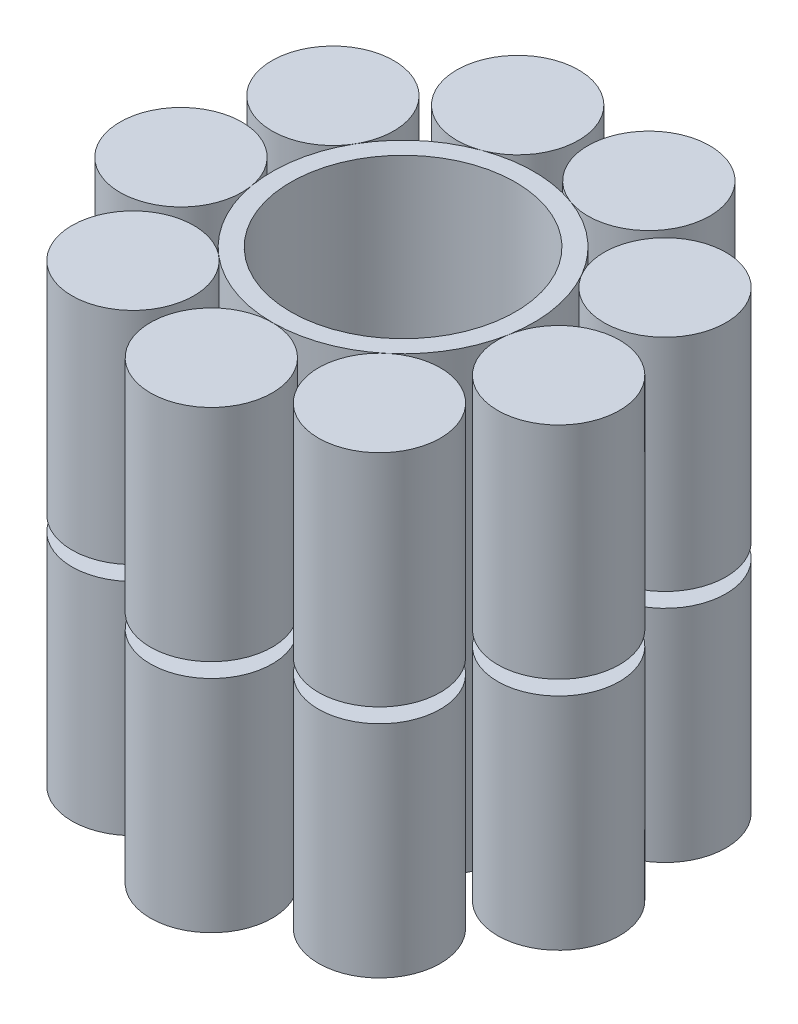
ISO-10303-21;
HEADER;
FILE_DESCRIPTION(('STEP AP214'),'2;1');
FILE_NAME('part.step','',(''),(''),'','','');
FILE_SCHEMA(('AUTOMOTIVE_DESIGN { 1 0 10303 214 1 1 1 1 }'));
ENDSEC;
DATA;
#1=APPLICATION_CONTEXT('core data for automotive mechanical design processes');
#2=APPLICATION_PROTOCOL_DEFINITION('international standard','automotive_design',2000,#1);
#3=PRODUCT_CONTEXT('',#1,'mechanical');
#4=PRODUCT('Part','Part','',(#3));
#5=PRODUCT_RELATED_PRODUCT_CATEGORY('part','',(#4));
#6=PRODUCT_DEFINITION_FORMATION('','',#4);
#7=PRODUCT_DEFINITION_CONTEXT('part definition',#1,'design');
#8=PRODUCT_DEFINITION('design','',#6,#7);
#9=PRODUCT_DEFINITION_SHAPE('','',#8);
#10=(LENGTH_UNIT() NAMED_UNIT(*) SI_UNIT(.MILLI.,.METRE.));
#11=(NAMED_UNIT(*) PLANE_ANGLE_UNIT() SI_UNIT($,.RADIAN.));
#12=(NAMED_UNIT(*) SI_UNIT($,.STERADIAN.) SOLID_ANGLE_UNIT());
#13=UNCERTAINTY_MEASURE_WITH_UNIT(LENGTH_MEASURE(1.E-05),#10,'distance_accuracy_value','');
#14=(GEOMETRIC_REPRESENTATION_CONTEXT(3) GLOBAL_UNCERTAINTY_ASSIGNED_CONTEXT((#13)) GLOBAL_UNIT_ASSIGNED_CONTEXT((#10,
#11,#12)) REPRESENTATION_CONTEXT('',''));
#15=CARTESIAN_POINT('',(0.,0.,0.));
#16=DIRECTION('',(0.,0.,1.));
#17=DIRECTION('',(1.,0.,0.));
#18=AXIS2_PLACEMENT_3D('',#15,#16,#17);
#19=CARTESIAN_POINT('',(-34.4087421403248,127.,41.0067420623809));
#20=DIRECTION('',(0.,-1.,0.));
#21=DIRECTION('',(0.64278760968653,0.,-0.766044443118986));
#22=AXIS2_PLACEMENT_3D('',#19,#20,#21);
#23=CYLINDRICAL_SURFACE('',#22,17.018);
#24=CARTESIAN_POINT('',(-34.4087421403248,65.532,41.0067420623809));
#25=DIRECTION('',(0.,1.,0.));
#26=DIRECTION('',(0.,0.,1.));
#27=AXIS2_PLACEMENT_3D('',#24,#25,#26);
#28=CIRCLE('',#27,17.018);
#29=CARTESIAN_POINT('',(-34.4087421403248,65.532,58.0247420623809));
#30=VERTEX_POINT('',#29);
#31=EDGE_CURVE('E49',#30,#30,#28,.T.);
#32=ORIENTED_EDGE('',*,*,#31,.T.);
#33=EDGE_LOOP('',(#32));
#34=FACE_BOUND('',#33,.T.);
#35=CARTESIAN_POINT('',(-34.4087421403248,127.,41.0067420623809));
#36=DIRECTION('',(0.,1.,0.));
#37=DIRECTION('',(-0.64278760968653,0.,0.766044443118986));
#38=AXIS2_PLACEMENT_3D('',#35,#36,#37);
#39=CIRCLE('',#38,17.018);
#40=CARTESIAN_POINT('',(-45.3477016819702,127.,54.0432863953798));
#41=VERTEX_POINT('',#40);
#42=EDGE_CURVE('E11',#41,#41,#39,.T.);
#43=ORIENTED_EDGE('',*,*,#42,.F.);
#44=EDGE_LOOP('',(#43));
#45=FACE_BOUND('',#44,.T.);
#46=ADVANCED_FACE('F43',(#34,#45),#23,.T.);
#47=CARTESIAN_POINT('',(-34.4087421403248,127.,41.0067420623809));
#48=DIRECTION('',(0.,1.,0.));
#49=DIRECTION('',(-0.64278760968653,0.,0.766044443118986));
#50=AXIS2_PLACEMENT_3D('',#47,#48,#49);
#51=PLANE('',#50);
#52=ORIENTED_EDGE('',*,*,#42,.T.);
#53=EDGE_LOOP('',(#52));
#54=FACE_BOUND('',#53,.T.);
#55=ADVANCED_FACE('F59',(#54),#51,.T.);
#56=CARTESIAN_POINT('',(0.,65.532,0.));
#57=DIRECTION('',(0.,1.,0.));
#58=DIRECTION('',(0.,0.,1.));
#59=AXIS2_PLACEMENT_3D('',#56,#57,#58);
#60=PLANE('',#59);
#61=ORIENTED_EDGE('',*,*,#31,.F.);
#62=EDGE_LOOP('',(#61));
#63=FACE_BOUND('',#62,.T.);
#64=ADVANCED_FACE('F57',(#63),#60,.F.);
#65=CLOSED_SHELL('',(#46,#55,#64));
#66=MANIFOLD_SOLID_BREP('B2',#65);
#67=CARTESIAN_POINT('',(-52.7172514226199,127.,9.29547377460016));
#68=DIRECTION('',(0.,-1.,0.));
#69=DIRECTION('',(0.984807753012206,0.,-0.17364817766694));
#70=AXIS2_PLACEMENT_3D('',#67,#68,#69);
#71=CYLINDRICAL_SURFACE('',#70,17.018);
#72=CARTESIAN_POINT('',(-52.7172514226199,65.532,9.29547377460016));
#73=DIRECTION('',(0.,1.,0.));
#74=DIRECTION('',(0.,0.,1.));
#75=AXIS2_PLACEMENT_3D('',#72,#73,#74);
#76=CIRCLE('',#75,17.018);
#77=CARTESIAN_POINT('',(-52.7172514226199,65.532,26.3134737746002));
#78=VERTEX_POINT('',#77);
#79=EDGE_CURVE('E97',#78,#78,#76,.T.);
#80=ORIENTED_EDGE('',*,*,#79,.T.);
#81=EDGE_LOOP('',(#80));
#82=FACE_BOUND('',#81,.T.);
#83=CARTESIAN_POINT('',(-52.7172514226199,127.,9.29547377460016));
#84=DIRECTION('',(0.,1.,0.));
#85=DIRECTION('',(-0.984807753012206,0.,0.17364817766694));
#86=AXIS2_PLACEMENT_3D('',#83,#84,#85);
#87=CIRCLE('',#86,17.018);
#88=CARTESIAN_POINT('',(-69.4767097633816,127.,12.2506184621361));
#89=VERTEX_POINT('',#88);
#90=EDGE_CURVE('E42',#89,#89,#87,.T.);
#91=ORIENTED_EDGE('',*,*,#90,.F.);
#92=EDGE_LOOP('',(#91));
#93=FACE_BOUND('',#92,.T.);
#94=ADVANCED_FACE('F91',(#82,#93),#71,.T.);
#95=CARTESIAN_POINT('',(-52.7172514226199,127.,9.29547377460016));
#96=DIRECTION('',(0.,1.,0.));
#97=DIRECTION('',(-0.984807753012206,0.,0.17364817766694));
#98=AXIS2_PLACEMENT_3D('',#95,#96,#97);
#99=PLANE('',#98);
#100=ORIENTED_EDGE('',*,*,#90,.T.);
#101=EDGE_LOOP('',(#100));
#102=FACE_BOUND('',#101,.T.);
#103=ADVANCED_FACE('F107',(#102),#99,.T.);
#104=CARTESIAN_POINT('',(0.,65.532,0.));
#105=DIRECTION('',(0.,1.,0.));
#106=DIRECTION('',(0.,0.,1.));
#107=AXIS2_PLACEMENT_3D('',#104,#105,#106);
#108=PLANE('',#107);
#109=ORIENTED_EDGE('',*,*,#79,.F.);
#110=EDGE_LOOP('',(#109));
#111=FACE_BOUND('',#110,.T.);
#112=ADVANCED_FACE('F105',(#111),#108,.F.);
#113=CLOSED_SHELL('',(#94,#103,#112));
#114=MANIFOLD_SOLID_BREP('B6',#113);
#115=CARTESIAN_POINT('',(-46.3587728772831,127.,-26.7652499999996));
#116=DIRECTION('',(0.,-1.,0.));
#117=DIRECTION('',(0.866025403784443,0.,0.499999999999992));
#118=AXIS2_PLACEMENT_3D('',#115,#116,#117);
#119=CYLINDRICAL_SURFACE('',#118,17.018);
#120=CARTESIAN_POINT('',(-46.3587728772831,65.532,-26.7652499999996));
#121=DIRECTION('',(0.,1.,0.));
#122=DIRECTION('',(0.,0.,1.));
#123=AXIS2_PLACEMENT_3D('',#120,#121,#122);
#124=CIRCLE('',#123,17.018);
#125=CARTESIAN_POINT('',(-46.3587728772831,65.532,-9.74724999999957));
#126=VERTEX_POINT('',#125);
#127=EDGE_CURVE('E145',#126,#126,#124,.T.);
#128=ORIENTED_EDGE('',*,*,#127,.T.);
#129=EDGE_LOOP('',(#128));
#130=FACE_BOUND('',#129,.T.);
#131=CARTESIAN_POINT('',(-46.3587728772831,127.,-26.7652499999996));
#132=DIRECTION('',(0.,1.,0.));
#133=DIRECTION('',(-0.866025403784443,0.,-0.499999999999992));
#134=AXIS2_PLACEMENT_3D('',#131,#132,#133);
#135=CIRCLE('',#134,17.018);
#136=CARTESIAN_POINT('',(-61.0967931988868,127.,-35.2742499999994));
#137=VERTEX_POINT('',#136);
#138=EDGE_CURVE('E90',#137,#137,#135,.T.);
#139=ORIENTED_EDGE('',*,*,#138,.F.);
#140=EDGE_LOOP('',(#139));
#141=FACE_BOUND('',#140,.T.);
#142=ADVANCED_FACE('F139',(#130,#141),#119,.T.);
#143=CARTESIAN_POINT('',(-46.3587728772831,127.,-26.7652499999996));
#144=DIRECTION('',(0.,1.,0.));
#145=DIRECTION('',(-0.866025403784443,0.,-0.499999999999992));
#146=AXIS2_PLACEMENT_3D('',#143,#144,#145);
#147=PLANE('',#146);
#148=ORIENTED_EDGE('',*,*,#138,.T.);
#149=EDGE_LOOP('',(#148));
#150=FACE_BOUND('',#149,.T.);
#151=ADVANCED_FACE('F155',(#150),#147,.T.);
#152=CARTESIAN_POINT('',(0.,65.532,0.));
#153=DIRECTION('',(0.,1.,0.));
#154=DIRECTION('',(0.,0.,1.));
#155=AXIS2_PLACEMENT_3D('',#152,#153,#154);
#156=PLANE('',#155);
#157=ORIENTED_EDGE('',*,*,#127,.F.);
#158=EDGE_LOOP('',(#157));
#159=FACE_BOUND('',#158,.T.);
#160=ADVANCED_FACE('F153',(#159),#156,.F.);
#161=CLOSED_SHELL('',(#142,#151,#160));
#162=MANIFOLD_SOLID_BREP('B37',#161);
#163=CARTESIAN_POINT('',(-18.3085092822951,127.,-50.3022158369799));
#164=DIRECTION('',(0.,-1.,0.));
#165=DIRECTION('',(0.342020143325676,0.,0.939692620785906));
#166=AXIS2_PLACEMENT_3D('',#163,#164,#165);
#167=CYLINDRICAL_SURFACE('',#166,17.018);
#168=CARTESIAN_POINT('',(-18.3085092822951,65.532,-50.3022158369799));
#169=DIRECTION('',(0.,1.,0.));
#170=DIRECTION('',(0.,0.,1.));
#171=AXIS2_PLACEMENT_3D('',#168,#169,#170);
#172=CIRCLE('',#171,17.018);
#173=CARTESIAN_POINT('',(-18.3085092822951,65.532,-33.2842158369799));
#174=VERTEX_POINT('',#173);
#175=EDGE_CURVE('E193',#174,#174,#172,.T.);
#176=ORIENTED_EDGE('',*,*,#175,.T.);
#177=EDGE_LOOP('',(#176));
#178=FACE_BOUND('',#177,.T.);
#179=CARTESIAN_POINT('',(-18.3085092822951,127.,-50.3022158369799));
#180=DIRECTION('',(0.,1.,0.));
#181=DIRECTION('',(-0.342020143325676,0.,-0.939692620785906));
#182=AXIS2_PLACEMENT_3D('',#179,#180,#181);
#183=CIRCLE('',#182,17.018);
#184=CARTESIAN_POINT('',(-24.1290080814114,127.,-66.2939048575145));
#185=VERTEX_POINT('',#184);
#186=EDGE_CURVE('E138',#185,#185,#183,.T.);
#187=ORIENTED_EDGE('',*,*,#186,.F.);
#188=EDGE_LOOP('',(#187));
#189=FACE_BOUND('',#188,.T.);
#190=ADVANCED_FACE('F187',(#178,#189),#167,.T.);
#191=CARTESIAN_POINT('',(-18.3085092822951,127.,-50.3022158369799));
#192=DIRECTION('',(0.,1.,0.));
#193=DIRECTION('',(-0.342020143325676,0.,-0.939692620785906));
#194=AXIS2_PLACEMENT_3D('',#191,#192,#193);
#195=PLANE('',#194);
#196=ORIENTED_EDGE('',*,*,#186,.T.);
#197=EDGE_LOOP('',(#196));
#198=FACE_BOUND('',#197,.T.);
#199=ADVANCED_FACE('F203',(#198),#195,.T.);
#200=CARTESIAN_POINT('',(0.,65.532,0.));
#201=DIRECTION('',(0.,1.,0.));
#202=DIRECTION('',(0.,0.,1.));
#203=AXIS2_PLACEMENT_3D('',#200,#201,#202);
#204=PLANE('',#203);
#205=ORIENTED_EDGE('',*,*,#175,.F.);
#206=EDGE_LOOP('',(#205));
#207=FACE_BOUND('',#206,.T.);
#208=ADVANCED_FACE('F201',(#207),#204,.F.);
#209=CLOSED_SHELL('',(#190,#199,#208));
#210=MANIFOLD_SOLID_BREP('B85',#209);
#211=CARTESIAN_POINT('',(18.3085092822944,127.,-50.3022158369802));
#212=DIRECTION('',(0.,-1.,0.));
#213=DIRECTION('',(-0.342020143325663,0.,0.939692620785911));
#214=AXIS2_PLACEMENT_3D('',#211,#212,#213);
#215=CYLINDRICAL_SURFACE('',#214,17.018);
#216=CARTESIAN_POINT('',(18.3085092822944,65.532,-50.3022158369802));
#217=DIRECTION('',(0.,1.,0.));
#218=DIRECTION('',(0.,0.,1.));
#219=AXIS2_PLACEMENT_3D('',#216,#217,#218);
#220=CIRCLE('',#219,17.018);
#221=CARTESIAN_POINT('',(18.3085092822944,65.532,-33.2842158369802));
#222=VERTEX_POINT('',#221);
#223=EDGE_CURVE('E241',#222,#222,#220,.T.);
#224=ORIENTED_EDGE('',*,*,#223,.T.);
#225=EDGE_LOOP('',(#224));
#226=FACE_BOUND('',#225,.T.);
#227=CARTESIAN_POINT('',(18.3085092822944,127.,-50.3022158369802));
#228=DIRECTION('',(0.,1.,0.));
#229=DIRECTION('',(0.342020143325663,0.,-0.939692620785911));
#230=AXIS2_PLACEMENT_3D('',#227,#228,#229);
#231=CIRCLE('',#230,17.018);
#232=CARTESIAN_POINT('',(24.1290080814105,127.,-66.2939048575148));
#233=VERTEX_POINT('',#232);
#234=EDGE_CURVE('E186',#233,#233,#231,.T.);
#235=ORIENTED_EDGE('',*,*,#234,.F.);
#236=EDGE_LOOP('',(#235));
#237=FACE_BOUND('',#236,.T.);
#238=ADVANCED_FACE('F235',(#226,#237),#215,.T.);
#239=CARTESIAN_POINT('',(18.3085092822944,127.,-50.3022158369802));
#240=DIRECTION('',(0.,1.,0.));
#241=DIRECTION('',(0.342020143325663,0.,-0.939692620785911));
#242=AXIS2_PLACEMENT_3D('',#239,#240,#241);
#243=PLANE('',#242);
#244=ORIENTED_EDGE('',*,*,#234,.T.);
#245=EDGE_LOOP('',(#244));
#246=FACE_BOUND('',#245,.T.);
#247=ADVANCED_FACE('F251',(#246),#243,.T.);
#248=CARTESIAN_POINT('',(0.,65.532,0.));
#249=DIRECTION('',(0.,1.,0.));
#250=DIRECTION('',(0.,0.,1.));
#251=AXIS2_PLACEMENT_3D('',#248,#249,#250);
#252=PLANE('',#251);
#253=ORIENTED_EDGE('',*,*,#223,.F.);
#254=EDGE_LOOP('',(#253));
#255=FACE_BOUND('',#254,.T.);
#256=ADVANCED_FACE('F249',(#255),#252,.F.);
#257=CLOSED_SHELL('',(#238,#247,#256));
#258=MANIFOLD_SOLID_BREP('B133',#257);
#259=CARTESIAN_POINT('',(46.3587728772828,127.,-26.7652500000002));
#260=DIRECTION('',(0.,-1.,0.));
#261=DIRECTION('',(-0.866025403784436,0.,0.500000000000004));
#262=AXIS2_PLACEMENT_3D('',#259,#260,#261);
#263=CYLINDRICAL_SURFACE('',#262,17.018);
#264=CARTESIAN_POINT('',(46.3587728772828,65.532,-26.7652500000002));
#265=DIRECTION('',(0.,1.,0.));
#266=DIRECTION('',(0.,0.,1.));
#267=AXIS2_PLACEMENT_3D('',#264,#265,#266);
#268=CIRCLE('',#267,17.018);
#269=CARTESIAN_POINT('',(46.3587728772828,65.532,-9.74725000000021));
#270=VERTEX_POINT('',#269);
#271=EDGE_CURVE('E289',#270,#270,#268,.T.);
#272=ORIENTED_EDGE('',*,*,#271,.T.);
#273=EDGE_LOOP('',(#272));
#274=FACE_BOUND('',#273,.T.);
#275=CARTESIAN_POINT('',(46.3587728772828,127.,-26.7652500000002));
#276=DIRECTION('',(0.,1.,0.));
#277=DIRECTION('',(0.866025403784436,0.,-0.500000000000004));
#278=AXIS2_PLACEMENT_3D('',#275,#276,#277);
#279=CIRCLE('',#278,17.018);
#280=CARTESIAN_POINT('',(61.0967931988863,127.,-35.2742500000003));
#281=VERTEX_POINT('',#280);
#282=EDGE_CURVE('E234',#281,#281,#279,.T.);
#283=ORIENTED_EDGE('',*,*,#282,.F.);
#284=EDGE_LOOP('',(#283));
#285=FACE_BOUND('',#284,.T.);
#286=ADVANCED_FACE('F283',(#274,#285),#263,.T.);
#287=CARTESIAN_POINT('',(46.3587728772828,127.,-26.7652500000002));
#288=DIRECTION('',(0.,1.,0.));
#289=DIRECTION('',(0.866025403784436,0.,-0.500000000000004));
#290=AXIS2_PLACEMENT_3D('',#287,#288,#289);
#291=PLANE('',#290);
#292=ORIENTED_EDGE('',*,*,#282,.T.);
#293=EDGE_LOOP('',(#292));
#294=FACE_BOUND('',#293,.T.);
#295=ADVANCED_FACE('F299',(#294),#291,.T.);
#296=CARTESIAN_POINT('',(0.,65.532,0.));
#297=DIRECTION('',(0.,1.,0.));
#298=DIRECTION('',(0.,0.,1.));
#299=AXIS2_PLACEMENT_3D('',#296,#297,#298);
#300=PLANE('',#299);
#301=ORIENTED_EDGE('',*,*,#271,.F.);
#302=EDGE_LOOP('',(#301));
#303=FACE_BOUND('',#302,.T.);
#304=ADVANCED_FACE('F297',(#303),#300,.F.);
#305=CLOSED_SHELL('',(#286,#295,#304));
#306=MANIFOLD_SOLID_BREP('B181',#305);
#307=CARTESIAN_POINT('',(52.71725142262,127.,9.29547377459945));
#308=DIRECTION('',(0.,-1.,0.));
#309=DIRECTION('',(-0.984807753012209,0.,-0.173648177666927));
#310=AXIS2_PLACEMENT_3D('',#307,#308,#309);
#311=CYLINDRICAL_SURFACE('',#310,17.018);
#312=CARTESIAN_POINT('',(52.71725142262,65.532,9.29547377459945));
#313=DIRECTION('',(0.,1.,0.));
#314=DIRECTION('',(0.,0.,1.));
#315=AXIS2_PLACEMENT_3D('',#312,#313,#314);
#316=CIRCLE('',#315,17.018);
#317=CARTESIAN_POINT('',(52.71725142262,65.532,26.3134737745995));
#318=VERTEX_POINT('',#317);
#319=EDGE_CURVE('E337',#318,#318,#316,.T.);
#320=ORIENTED_EDGE('',*,*,#319,.T.);
#321=EDGE_LOOP('',(#320));
#322=FACE_BOUND('',#321,.T.);
#323=CARTESIAN_POINT('',(52.71725142262,127.,9.29547377459945));
#324=DIRECTION('',(0.,1.,0.));
#325=DIRECTION('',(0.984807753012209,0.,0.173648177666927));
#326=AXIS2_PLACEMENT_3D('',#323,#324,#325);
#327=CIRCLE('',#326,17.018);
#328=CARTESIAN_POINT('',(69.4767097633818,127.,12.2506184621352));
#329=VERTEX_POINT('',#328);
#330=EDGE_CURVE('E282',#329,#329,#327,.T.);
#331=ORIENTED_EDGE('',*,*,#330,.F.);
#332=EDGE_LOOP('',(#331));
#333=FACE_BOUND('',#332,.T.);
#334=ADVANCED_FACE('F331',(#322,#333),#311,.T.);
#335=CARTESIAN_POINT('',(52.71725142262,127.,9.29547377459945));
#336=DIRECTION('',(0.,1.,0.));
#337=DIRECTION('',(0.984807753012209,0.,0.173648177666927));
#338=AXIS2_PLACEMENT_3D('',#335,#336,#337);
#339=PLANE('',#338);
#340=ORIENTED_EDGE('',*,*,#330,.T.);
#341=EDGE_LOOP('',(#340));
#342=FACE_BOUND('',#341,.T.);
#343=ADVANCED_FACE('F347',(#342),#339,.T.);
#344=CARTESIAN_POINT('',(0.,65.532,0.));
#345=DIRECTION('',(0.,1.,0.));
#346=DIRECTION('',(0.,0.,1.));
#347=AXIS2_PLACEMENT_3D('',#344,#345,#346);
#348=PLANE('',#347);
#349=ORIENTED_EDGE('',*,*,#319,.F.);
#350=EDGE_LOOP('',(#349));
#351=FACE_BOUND('',#350,.T.);
#352=ADVANCED_FACE('F345',(#351),#348,.F.);
#353=CLOSED_SHELL('',(#334,#343,#352));
#354=MANIFOLD_SOLID_BREP('B229',#353);
#355=CARTESIAN_POINT('',(34.4087421403254,127.,41.0067420623804));
#356=DIRECTION('',(0.,-1.,0.));
#357=DIRECTION('',(-0.642787609686541,0.,-0.766044443118977));
#358=AXIS2_PLACEMENT_3D('',#355,#356,#357);
#359=CYLINDRICAL_SURFACE('',#358,17.018);
#360=CARTESIAN_POINT('',(34.4087421403254,65.532,41.0067420623804));
#361=DIRECTION('',(0.,1.,0.));
#362=DIRECTION('',(0.,0.,1.));
#363=AXIS2_PLACEMENT_3D('',#360,#361,#362);
#364=CIRCLE('',#363,17.018);
#365=CARTESIAN_POINT('',(34.4087421403254,65.532,58.0247420623804));
#366=VERTEX_POINT('',#365);
#367=EDGE_CURVE('E385',#366,#366,#364,.T.);
#368=ORIENTED_EDGE('',*,*,#367,.T.);
#369=EDGE_LOOP('',(#368));
#370=FACE_BOUND('',#369,.T.);
#371=CARTESIAN_POINT('',(34.4087421403254,127.,41.0067420623804));
#372=DIRECTION('',(0.,1.,0.));
#373=DIRECTION('',(0.642787609686541,0.,0.766044443118977));
#374=AXIS2_PLACEMENT_3D('',#371,#372,#373);
#375=CIRCLE('',#374,17.018);
#376=CARTESIAN_POINT('',(45.3477016819709,127.,54.0432863953792));
#377=VERTEX_POINT('',#376);
#378=EDGE_CURVE('E330',#377,#377,#375,.T.);
#379=ORIENTED_EDGE('',*,*,#378,.F.);
#380=EDGE_LOOP('',(#379));
#381=FACE_BOUND('',#380,.T.);
#382=ADVANCED_FACE('F379',(#370,#381),#359,.T.);
#383=CARTESIAN_POINT('',(34.4087421403254,127.,41.0067420623804));
#384=DIRECTION('',(0.,1.,0.));
#385=DIRECTION('',(0.642787609686541,0.,0.766044443118977));
#386=AXIS2_PLACEMENT_3D('',#383,#384,#385);
#387=PLANE('',#386);
#388=ORIENTED_EDGE('',*,*,#378,.T.);
#389=EDGE_LOOP('',(#388));
#390=FACE_BOUND('',#389,.T.);
#391=ADVANCED_FACE('F395',(#390),#387,.T.);
#392=CARTESIAN_POINT('',(0.,65.532,0.));
#393=DIRECTION('',(0.,1.,0.));
#394=DIRECTION('',(0.,0.,1.));
#395=AXIS2_PLACEMENT_3D('',#392,#393,#394);
#396=PLANE('',#395);
#397=ORIENTED_EDGE('',*,*,#367,.F.);
#398=EDGE_LOOP('',(#397));
#399=FACE_BOUND('',#398,.T.);
#400=ADVANCED_FACE('F393',(#399),#396,.F.);
#401=CLOSED_SHELL('',(#382,#391,#400));
#402=MANIFOLD_SOLID_BREP('B277',#401);
#403=CARTESIAN_POINT('',(0.,127.,53.5305));
#404=DIRECTION('',(0.,-1.,0.));
#405=DIRECTION('',(0.,0.,-1.));
#406=AXIS2_PLACEMENT_3D('',#403,#404,#405);
#407=CYLINDRICAL_SURFACE('',#406,17.018);
#408=CARTESIAN_POINT('',(0.,65.532,53.5305));
#409=DIRECTION('',(0.,1.,0.));
#410=DIRECTION('',(0.,0.,1.));
#411=AXIS2_PLACEMENT_3D('',#408,#409,#410);
#412=CIRCLE('',#411,17.018);
#413=CARTESIAN_POINT('',(0.,65.532,70.5485));
#414=VERTEX_POINT('',#413);
#415=EDGE_CURVE('E433',#414,#414,#412,.T.);
#416=ORIENTED_EDGE('',*,*,#415,.T.);
#417=EDGE_LOOP('',(#416));
#418=FACE_BOUND('',#417,.T.);
#419=CARTESIAN_POINT('',(0.,127.,53.5305));
#420=DIRECTION('',(0.,1.,0.));
#421=DIRECTION('',(0.,0.,1.));
#422=AXIS2_PLACEMENT_3D('',#419,#420,#421);
#423=CIRCLE('',#422,17.018);
#424=CARTESIAN_POINT('',(0.,127.,70.5485));
#425=VERTEX_POINT('',#424);
#426=EDGE_CURVE('E378',#425,#425,#423,.T.);
#427=ORIENTED_EDGE('',*,*,#426,.F.);
#428=EDGE_LOOP('',(#427));
#429=FACE_BOUND('',#428,.T.);
#430=ADVANCED_FACE('F427',(#418,#429),#407,.T.);
#431=CARTESIAN_POINT('',(0.,127.,53.5305));
#432=DIRECTION('',(0.,1.,0.));
#433=DIRECTION('',(0.,0.,1.));
#434=AXIS2_PLACEMENT_3D('',#431,#432,#433);
#435=PLANE('',#434);
#436=ORIENTED_EDGE('',*,*,#426,.T.);
#437=EDGE_LOOP('',(#436));
#438=FACE_BOUND('',#437,.T.);
#439=ADVANCED_FACE('F443',(#438),#435,.T.);
#440=CARTESIAN_POINT('',(0.,65.532,0.));
#441=DIRECTION('',(0.,1.,0.));
#442=DIRECTION('',(0.,0.,1.));
#443=AXIS2_PLACEMENT_3D('',#440,#441,#442);
#444=PLANE('',#443);
#445=ORIENTED_EDGE('',*,*,#415,.F.);
#446=EDGE_LOOP('',(#445));
#447=FACE_BOUND('',#446,.T.);
#448=ADVANCED_FACE('F441',(#447),#444,.F.);
#449=CLOSED_SHELL('',(#430,#439,#448));
#450=MANIFOLD_SOLID_BREP('B325',#449);
#451=CARTESIAN_POINT('',(-34.4087421403248,0.,41.0067420623809));
#452=DIRECTION('',(0.,1.,0.));
#453=DIRECTION('',(-0.64278760968653,0.,0.766044443118986));
#454=AXIS2_PLACEMENT_3D('',#451,#452,#453);
#455=PLANE('',#454);
#456=CARTESIAN_POINT('',(-34.4087421403248,0.,41.0067420623809));
#457=DIRECTION('',(0.,1.,0.));
#458=DIRECTION('',(-0.64278760968653,0.,0.766044443118986));
#459=AXIS2_PLACEMENT_3D('',#456,#457,#458);
#460=CIRCLE('',#459,17.018);
#461=CARTESIAN_POINT('',(-45.3477016819702,0.,54.0432863953798));
#462=VERTEX_POINT('',#461);
#463=EDGE_CURVE('E482',#462,#462,#460,.T.);
#464=ORIENTED_EDGE('',*,*,#463,.F.);
#465=EDGE_LOOP('',(#464));
#466=FACE_BOUND('',#465,.T.);
#467=ADVANCED_FACE('F475',(#466),#455,.F.);
#468=CARTESIAN_POINT('',(-34.4087421403248,127.,41.0067420623809));
#469=DIRECTION('',(0.,-1.,0.));
#470=DIRECTION('',(0.64278760968653,0.,-0.766044443118986));
#471=AXIS2_PLACEMENT_3D('',#468,#469,#470);
#472=CYLINDRICAL_SURFACE('',#471,17.018);
#473=ORIENTED_EDGE('',*,*,#463,.T.);
#474=EDGE_LOOP('',(#473));
#475=FACE_BOUND('',#474,.T.);
#476=CARTESIAN_POINT('',(-34.4087421403248,61.468,41.0067420623809));
#477=DIRECTION('',(0.,1.,0.));
#478=DIRECTION('',(0.,0.,1.));
#479=AXIS2_PLACEMENT_3D('',#476,#477,#478);
#480=CIRCLE('',#479,17.018);
#481=CARTESIAN_POINT('',(-34.4087421403248,61.468,58.0247420623809));
#482=VERTEX_POINT('',#481);
#483=EDGE_CURVE('E426',#482,#482,#480,.T.);
#484=ORIENTED_EDGE('',*,*,#483,.F.);
#485=EDGE_LOOP('',(#484));
#486=FACE_BOUND('',#485,.T.);
#487=ADVANCED_FACE('F477',(#475,#486),#472,.T.);
#488=CARTESIAN_POINT('',(0.,61.468,0.));
#489=DIRECTION('',(0.,1.,0.));
#490=DIRECTION('',(0.,0.,1.));
#491=AXIS2_PLACEMENT_3D('',#488,#489,#490);
#492=PLANE('',#491);
#493=ORIENTED_EDGE('',*,*,#483,.T.);
#494=EDGE_LOOP('',(#493));
#495=FACE_BOUND('',#494,.T.);
#496=ADVANCED_FACE('F494',(#495),#492,.T.);
#497=CLOSED_SHELL('',(#467,#487,#496));
#498=MANIFOLD_SOLID_BREP('B373',#497);
#499=CARTESIAN_POINT('',(-52.7172514226199,0.,9.29547377460016));
#500=DIRECTION('',(0.,1.,0.));
#501=DIRECTION('',(-0.984807753012206,0.,0.17364817766694));
#502=AXIS2_PLACEMENT_3D('',#499,#500,#501);
#503=PLANE('',#502);
#504=CARTESIAN_POINT('',(-52.7172514226199,0.,9.29547377460016));
#505=DIRECTION('',(0.,1.,0.));
#506=DIRECTION('',(-0.984807753012206,0.,0.17364817766694));
#507=AXIS2_PLACEMENT_3D('',#504,#505,#506);
#508=CIRCLE('',#507,17.018);
#509=CARTESIAN_POINT('',(-69.4767097633816,0.,12.2506184621361));
#510=VERTEX_POINT('',#509);
#511=EDGE_CURVE('E530',#510,#510,#508,.T.);
#512=ORIENTED_EDGE('',*,*,#511,.F.);
#513=EDGE_LOOP('',(#512));
#514=FACE_BOUND('',#513,.T.);
#515=ADVANCED_FACE('F523',(#514),#503,.F.);
#516=CARTESIAN_POINT('',(-52.7172514226199,127.,9.29547377460016));
#517=DIRECTION('',(0.,-1.,0.));
#518=DIRECTION('',(0.984807753012206,0.,-0.17364817766694));
#519=AXIS2_PLACEMENT_3D('',#516,#517,#518);
#520=CYLINDRICAL_SURFACE('',#519,17.018);
#521=ORIENTED_EDGE('',*,*,#511,.T.);
#522=EDGE_LOOP('',(#521));
#523=FACE_BOUND('',#522,.T.);
#524=CARTESIAN_POINT('',(-52.7172514226199,61.468,9.29547377460016));
#525=DIRECTION('',(0.,1.,0.));
#526=DIRECTION('',(0.,0.,1.));
#527=AXIS2_PLACEMENT_3D('',#524,#525,#526);
#528=CIRCLE('',#527,17.018);
#529=CARTESIAN_POINT('',(-52.7172514226199,61.468,26.3134737746002));
#530=VERTEX_POINT('',#529);
#531=EDGE_CURVE('E474',#530,#530,#528,.T.);
#532=ORIENTED_EDGE('',*,*,#531,.F.);
#533=EDGE_LOOP('',(#532));
#534=FACE_BOUND('',#533,.T.);
#535=ADVANCED_FACE('F525',(#523,#534),#520,.T.);
#536=CARTESIAN_POINT('',(0.,61.468,0.));
#537=DIRECTION('',(0.,1.,0.));
#538=DIRECTION('',(0.,0.,1.));
#539=AXIS2_PLACEMENT_3D('',#536,#537,#538);
#540=PLANE('',#539);
#541=ORIENTED_EDGE('',*,*,#531,.T.);
#542=EDGE_LOOP('',(#541));
#543=FACE_BOUND('',#542,.T.);
#544=ADVANCED_FACE('F542',(#543),#540,.T.);
#545=CLOSED_SHELL('',(#515,#535,#544));
#546=MANIFOLD_SOLID_BREP('B421',#545);
#547=CARTESIAN_POINT('',(-46.3587728772831,0.,-26.7652499999996));
#548=DIRECTION('',(0.,1.,0.));
#549=DIRECTION('',(-0.866025403784443,0.,-0.499999999999992));
#550=AXIS2_PLACEMENT_3D('',#547,#548,#549);
#551=PLANE('',#550);
#552=CARTESIAN_POINT('',(-46.3587728772831,0.,-26.7652499999996));
#553=DIRECTION('',(0.,1.,0.));
#554=DIRECTION('',(-0.866025403784443,0.,-0.499999999999992));
#555=AXIS2_PLACEMENT_3D('',#552,#553,#554);
#556=CIRCLE('',#555,17.018);
#557=CARTESIAN_POINT('',(-61.0967931988868,0.,-35.2742499999994));
#558=VERTEX_POINT('',#557);
#559=EDGE_CURVE('E578',#558,#558,#556,.T.);
#560=ORIENTED_EDGE('',*,*,#559,.F.);
#561=EDGE_LOOP('',(#560));
#562=FACE_BOUND('',#561,.T.);
#563=ADVANCED_FACE('F571',(#562),#551,.F.);
#564=CARTESIAN_POINT('',(-46.3587728772831,127.,-26.7652499999996));
#565=DIRECTION('',(0.,-1.,0.));
#566=DIRECTION('',(0.866025403784443,0.,0.499999999999992));
#567=AXIS2_PLACEMENT_3D('',#564,#565,#566);
#568=CYLINDRICAL_SURFACE('',#567,17.018);
#569=ORIENTED_EDGE('',*,*,#559,.T.);
#570=EDGE_LOOP('',(#569));
#571=FACE_BOUND('',#570,.T.);
#572=CARTESIAN_POINT('',(-46.3587728772831,61.468,-26.7652499999996));
#573=DIRECTION('',(0.,1.,0.));
#574=DIRECTION('',(0.,0.,1.));
#575=AXIS2_PLACEMENT_3D('',#572,#573,#574);
#576=CIRCLE('',#575,17.018);
#577=CARTESIAN_POINT('',(-46.3587728772831,61.468,-9.74724999999957));
#578=VERTEX_POINT('',#577);
#579=EDGE_CURVE('E522',#578,#578,#576,.T.);
#580=ORIENTED_EDGE('',*,*,#579,.F.);
#581=EDGE_LOOP('',(#580));
#582=FACE_BOUND('',#581,.T.);
#583=ADVANCED_FACE('F573',(#571,#582),#568,.T.);
#584=CARTESIAN_POINT('',(0.,61.468,0.));
#585=DIRECTION('',(0.,1.,0.));
#586=DIRECTION('',(0.,0.,1.));
#587=AXIS2_PLACEMENT_3D('',#584,#585,#586);
#588=PLANE('',#587);
#589=ORIENTED_EDGE('',*,*,#579,.T.);
#590=EDGE_LOOP('',(#589));
#591=FACE_BOUND('',#590,.T.);
#592=ADVANCED_FACE('F590',(#591),#588,.T.);
#593=CLOSED_SHELL('',(#563,#583,#592));
#594=MANIFOLD_SOLID_BREP('B469',#593);
#595=CARTESIAN_POINT('',(-18.3085092822951,0.,-50.3022158369799));
#596=DIRECTION('',(0.,1.,0.));
#597=DIRECTION('',(-0.342020143325676,0.,-0.939692620785906));
#598=AXIS2_PLACEMENT_3D('',#595,#596,#597);
#599=PLANE('',#598);
#600=CARTESIAN_POINT('',(-18.3085092822951,0.,-50.3022158369799));
#601=DIRECTION('',(0.,1.,0.));
#602=DIRECTION('',(-0.342020143325676,0.,-0.939692620785906));
#603=AXIS2_PLACEMENT_3D('',#600,#601,#602);
#604=CIRCLE('',#603,17.018);
#605=CARTESIAN_POINT('',(-24.1290080814114,0.,-66.2939048575145));
#606=VERTEX_POINT('',#605);
#607=EDGE_CURVE('E626',#606,#606,#604,.T.);
#608=ORIENTED_EDGE('',*,*,#607,.F.);
#609=EDGE_LOOP('',(#608));
#610=FACE_BOUND('',#609,.T.);
#611=ADVANCED_FACE('F619',(#610),#599,.F.);
#612=CARTESIAN_POINT('',(-18.3085092822951,127.,-50.3022158369799));
#613=DIRECTION('',(0.,-1.,0.));
#614=DIRECTION('',(0.342020143325676,0.,0.939692620785906));
#615=AXIS2_PLACEMENT_3D('',#612,#613,#614);
#616=CYLINDRICAL_SURFACE('',#615,17.018);
#617=ORIENTED_EDGE('',*,*,#607,.T.);
#618=EDGE_LOOP('',(#617));
#619=FACE_BOUND('',#618,.T.);
#620=CARTESIAN_POINT('',(-18.3085092822951,61.468,-50.3022158369799));
#621=DIRECTION('',(0.,1.,0.));
#622=DIRECTION('',(0.,0.,1.));
#623=AXIS2_PLACEMENT_3D('',#620,#621,#622);
#624=CIRCLE('',#623,17.018);
#625=CARTESIAN_POINT('',(-18.3085092822951,61.468,-33.2842158369799));
#626=VERTEX_POINT('',#625);
#627=EDGE_CURVE('E570',#626,#626,#624,.T.);
#628=ORIENTED_EDGE('',*,*,#627,.F.);
#629=EDGE_LOOP('',(#628));
#630=FACE_BOUND('',#629,.T.);
#631=ADVANCED_FACE('F621',(#619,#630),#616,.T.);
#632=CARTESIAN_POINT('',(0.,61.468,0.));
#633=DIRECTION('',(0.,1.,0.));
#634=DIRECTION('',(0.,0.,1.));
#635=AXIS2_PLACEMENT_3D('',#632,#633,#634);
#636=PLANE('',#635);
#637=ORIENTED_EDGE('',*,*,#627,.T.);
#638=EDGE_LOOP('',(#637));
#639=FACE_BOUND('',#638,.T.);
#640=ADVANCED_FACE('F638',(#639),#636,.T.);
#641=CLOSED_SHELL('',(#611,#631,#640));
#642=MANIFOLD_SOLID_BREP('B517',#641);
#643=CARTESIAN_POINT('',(18.3085092822944,0.,-50.3022158369802));
#644=DIRECTION('',(0.,1.,0.));
#645=DIRECTION('',(0.342020143325663,0.,-0.939692620785911));
#646=AXIS2_PLACEMENT_3D('',#643,#644,#645);
#647=PLANE('',#646);
#648=CARTESIAN_POINT('',(18.3085092822944,0.,-50.3022158369802));
#649=DIRECTION('',(0.,1.,0.));
#650=DIRECTION('',(0.342020143325663,0.,-0.939692620785911));
#651=AXIS2_PLACEMENT_3D('',#648,#649,#650);
#652=CIRCLE('',#651,17.018);
#653=CARTESIAN_POINT('',(24.1290080814105,0.,-66.2939048575148));
#654=VERTEX_POINT('',#653);
#655=EDGE_CURVE('E674',#654,#654,#652,.T.);
#656=ORIENTED_EDGE('',*,*,#655,.F.);
#657=EDGE_LOOP('',(#656));
#658=FACE_BOUND('',#657,.T.);
#659=ADVANCED_FACE('F667',(#658),#647,.F.);
#660=CARTESIAN_POINT('',(18.3085092822944,127.,-50.3022158369802));
#661=DIRECTION('',(0.,-1.,0.));
#662=DIRECTION('',(-0.342020143325663,0.,0.939692620785911));
#663=AXIS2_PLACEMENT_3D('',#660,#661,#662);
#664=CYLINDRICAL_SURFACE('',#663,17.018);
#665=ORIENTED_EDGE('',*,*,#655,.T.);
#666=EDGE_LOOP('',(#665));
#667=FACE_BOUND('',#666,.T.);
#668=CARTESIAN_POINT('',(18.3085092822944,61.468,-50.3022158369802));
#669=DIRECTION('',(0.,1.,0.));
#670=DIRECTION('',(0.,0.,1.));
#671=AXIS2_PLACEMENT_3D('',#668,#669,#670);
#672=CIRCLE('',#671,17.018);
#673=CARTESIAN_POINT('',(18.3085092822944,61.468,-33.2842158369802));
#674=VERTEX_POINT('',#673);
#675=EDGE_CURVE('E618',#674,#674,#672,.T.);
#676=ORIENTED_EDGE('',*,*,#675,.F.);
#677=EDGE_LOOP('',(#676));
#678=FACE_BOUND('',#677,.T.);
#679=ADVANCED_FACE('F669',(#667,#678),#664,.T.);
#680=CARTESIAN_POINT('',(0.,61.468,0.));
#681=DIRECTION('',(0.,1.,0.));
#682=DIRECTION('',(0.,0.,1.));
#683=AXIS2_PLACEMENT_3D('',#680,#681,#682);
#684=PLANE('',#683);
#685=ORIENTED_EDGE('',*,*,#675,.T.);
#686=EDGE_LOOP('',(#685));
#687=FACE_BOUND('',#686,.T.);
#688=ADVANCED_FACE('F686',(#687),#684,.T.);
#689=CLOSED_SHELL('',(#659,#679,#688));
#690=MANIFOLD_SOLID_BREP('B565',#689);
#691=CARTESIAN_POINT('',(46.3587728772828,0.,-26.7652500000002));
#692=DIRECTION('',(0.,1.,0.));
#693=DIRECTION('',(0.866025403784436,0.,-0.500000000000004));
#694=AXIS2_PLACEMENT_3D('',#691,#692,#693);
#695=PLANE('',#694);
#696=CARTESIAN_POINT('',(46.3587728772828,0.,-26.7652500000002));
#697=DIRECTION('',(0.,1.,0.));
#698=DIRECTION('',(0.866025403784436,0.,-0.500000000000004));
#699=AXIS2_PLACEMENT_3D('',#696,#697,#698);
#700=CIRCLE('',#699,17.018);
#701=CARTESIAN_POINT('',(61.0967931988863,0.,-35.2742500000003));
#702=VERTEX_POINT('',#701);
#703=EDGE_CURVE('E722',#702,#702,#700,.T.);
#704=ORIENTED_EDGE('',*,*,#703,.F.);
#705=EDGE_LOOP('',(#704));
#706=FACE_BOUND('',#705,.T.);
#707=ADVANCED_FACE('F715',(#706),#695,.F.);
#708=CARTESIAN_POINT('',(46.3587728772828,127.,-26.7652500000002));
#709=DIRECTION('',(0.,-1.,0.));
#710=DIRECTION('',(-0.866025403784436,0.,0.500000000000004));
#711=AXIS2_PLACEMENT_3D('',#708,#709,#710);
#712=CYLINDRICAL_SURFACE('',#711,17.018);
#713=ORIENTED_EDGE('',*,*,#703,.T.);
#714=EDGE_LOOP('',(#713));
#715=FACE_BOUND('',#714,.T.);
#716=CARTESIAN_POINT('',(46.3587728772828,61.468,-26.7652500000002));
#717=DIRECTION('',(0.,1.,0.));
#718=DIRECTION('',(0.,0.,1.));
#719=AXIS2_PLACEMENT_3D('',#716,#717,#718);
#720=CIRCLE('',#719,17.018);
#721=CARTESIAN_POINT('',(46.3587728772828,61.468,-9.74725000000021));
#722=VERTEX_POINT('',#721);
#723=EDGE_CURVE('E666',#722,#722,#720,.T.);
#724=ORIENTED_EDGE('',*,*,#723,.F.);
#725=EDGE_LOOP('',(#724));
#726=FACE_BOUND('',#725,.T.);
#727=ADVANCED_FACE('F717',(#715,#726),#712,.T.);
#728=CARTESIAN_POINT('',(0.,61.468,0.));
#729=DIRECTION('',(0.,1.,0.));
#730=DIRECTION('',(0.,0.,1.));
#731=AXIS2_PLACEMENT_3D('',#728,#729,#730);
#732=PLANE('',#731);
#733=ORIENTED_EDGE('',*,*,#723,.T.);
#734=EDGE_LOOP('',(#733));
#735=FACE_BOUND('',#734,.T.);
#736=ADVANCED_FACE('F734',(#735),#732,.T.);
#737=CLOSED_SHELL('',(#707,#727,#736));
#738=MANIFOLD_SOLID_BREP('B613',#737);
#739=CARTESIAN_POINT('',(52.71725142262,0.,9.29547377459945));
#740=DIRECTION('',(0.,1.,0.));
#741=DIRECTION('',(0.984807753012209,0.,0.173648177666927));
#742=AXIS2_PLACEMENT_3D('',#739,#740,#741);
#743=PLANE('',#742);
#744=CARTESIAN_POINT('',(52.71725142262,0.,9.29547377459945));
#745=DIRECTION('',(0.,1.,0.));
#746=DIRECTION('',(0.984807753012209,0.,0.173648177666927));
#747=AXIS2_PLACEMENT_3D('',#744,#745,#746);
#748=CIRCLE('',#747,17.018);
#749=CARTESIAN_POINT('',(69.4767097633818,0.,12.2506184621352));
#750=VERTEX_POINT('',#749);
#751=EDGE_CURVE('E770',#750,#750,#748,.T.);
#752=ORIENTED_EDGE('',*,*,#751,.F.);
#753=EDGE_LOOP('',(#752));
#754=FACE_BOUND('',#753,.T.);
#755=ADVANCED_FACE('F763',(#754),#743,.F.);
#756=CARTESIAN_POINT('',(52.71725142262,127.,9.29547377459945));
#757=DIRECTION('',(0.,-1.,0.));
#758=DIRECTION('',(-0.984807753012209,0.,-0.173648177666927));
#759=AXIS2_PLACEMENT_3D('',#756,#757,#758);
#760=CYLINDRICAL_SURFACE('',#759,17.018);
#761=ORIENTED_EDGE('',*,*,#751,.T.);
#762=EDGE_LOOP('',(#761));
#763=FACE_BOUND('',#762,.T.);
#764=CARTESIAN_POINT('',(52.71725142262,61.468,9.29547377459945));
#765=DIRECTION('',(0.,1.,0.));
#766=DIRECTION('',(0.,0.,1.));
#767=AXIS2_PLACEMENT_3D('',#764,#765,#766);
#768=CIRCLE('',#767,17.018);
#769=CARTESIAN_POINT('',(52.71725142262,61.468,26.3134737745995));
#770=VERTEX_POINT('',#769);
#771=EDGE_CURVE('E714',#770,#770,#768,.T.);
#772=ORIENTED_EDGE('',*,*,#771,.F.);
#773=EDGE_LOOP('',(#772));
#774=FACE_BOUND('',#773,.T.);
#775=ADVANCED_FACE('F765',(#763,#774),#760,.T.);
#776=CARTESIAN_POINT('',(0.,61.468,0.));
#777=DIRECTION('',(0.,1.,0.));
#778=DIRECTION('',(0.,0.,1.));
#779=AXIS2_PLACEMENT_3D('',#776,#777,#778);
#780=PLANE('',#779);
#781=ORIENTED_EDGE('',*,*,#771,.T.);
#782=EDGE_LOOP('',(#781));
#783=FACE_BOUND('',#782,.T.);
#784=ADVANCED_FACE('F782',(#783),#780,.T.);
#785=CLOSED_SHELL('',(#755,#775,#784));
#786=MANIFOLD_SOLID_BREP('B661',#785);
#787=CARTESIAN_POINT('',(34.4087421403254,0.,41.0067420623804));
#788=DIRECTION('',(0.,1.,0.));
#789=DIRECTION('',(0.642787609686541,0.,0.766044443118977));
#790=AXIS2_PLACEMENT_3D('',#787,#788,#789);
#791=PLANE('',#790);
#792=CARTESIAN_POINT('',(34.4087421403254,0.,41.0067420623804));
#793=DIRECTION('',(0.,1.,0.));
#794=DIRECTION('',(0.642787609686541,0.,0.766044443118977));
#795=AXIS2_PLACEMENT_3D('',#792,#793,#794);
#796=CIRCLE('',#795,17.018);
#797=CARTESIAN_POINT('',(45.3477016819709,0.,54.0432863953792));
#798=VERTEX_POINT('',#797);
#799=EDGE_CURVE('E818',#798,#798,#796,.T.);
#800=ORIENTED_EDGE('',*,*,#799,.F.);
#801=EDGE_LOOP('',(#800));
#802=FACE_BOUND('',#801,.T.);
#803=ADVANCED_FACE('F811',(#802),#791,.F.);
#804=CARTESIAN_POINT('',(34.4087421403254,127.,41.0067420623804));
#805=DIRECTION('',(0.,-1.,0.));
#806=DIRECTION('',(-0.642787609686541,0.,-0.766044443118977));
#807=AXIS2_PLACEMENT_3D('',#804,#805,#806);
#808=CYLINDRICAL_SURFACE('',#807,17.018);
#809=ORIENTED_EDGE('',*,*,#799,.T.);
#810=EDGE_LOOP('',(#809));
#811=FACE_BOUND('',#810,.T.);
#812=CARTESIAN_POINT('',(34.4087421403254,61.468,41.0067420623804));
#813=DIRECTION('',(0.,1.,0.));
#814=DIRECTION('',(0.,0.,1.));
#815=AXIS2_PLACEMENT_3D('',#812,#813,#814);
#816=CIRCLE('',#815,17.018);
#817=CARTESIAN_POINT('',(34.4087421403254,61.468,58.0247420623804));
#818=VERTEX_POINT('',#817);
#819=EDGE_CURVE('E762',#818,#818,#816,.T.);
#820=ORIENTED_EDGE('',*,*,#819,.F.);
#821=EDGE_LOOP('',(#820));
#822=FACE_BOUND('',#821,.T.);
#823=ADVANCED_FACE('F813',(#811,#822),#808,.T.);
#824=CARTESIAN_POINT('',(0.,61.468,0.));
#825=DIRECTION('',(0.,1.,0.));
#826=DIRECTION('',(0.,0.,1.));
#827=AXIS2_PLACEMENT_3D('',#824,#825,#826);
#828=PLANE('',#827);
#829=ORIENTED_EDGE('',*,*,#819,.T.);
#830=EDGE_LOOP('',(#829));
#831=FACE_BOUND('',#830,.T.);
#832=ADVANCED_FACE('F830',(#831),#828,.T.);
#833=CLOSED_SHELL('',(#803,#823,#832));
#834=MANIFOLD_SOLID_BREP('B709',#833);
#835=CARTESIAN_POINT('',(0.,0.,53.5305));
#836=DIRECTION('',(0.,1.,0.));
#837=DIRECTION('',(0.,0.,1.));
#838=AXIS2_PLACEMENT_3D('',#835,#836,#837);
#839=PLANE('',#838);
#840=CARTESIAN_POINT('',(0.,0.,53.5305));
#841=DIRECTION('',(0.,1.,0.));
#842=DIRECTION('',(0.,0.,1.));
#843=AXIS2_PLACEMENT_3D('',#840,#841,#842);
#844=CIRCLE('',#843,17.018);
#845=CARTESIAN_POINT('',(0.,0.,70.5485));
#846=VERTEX_POINT('',#845);
#847=EDGE_CURVE('E865',#846,#846,#844,.T.);
#848=ORIENTED_EDGE('',*,*,#847,.F.);
#849=EDGE_LOOP('',(#848));
#850=FACE_BOUND('',#849,.T.);
#851=ADVANCED_FACE('F858',(#850),#839,.F.);
#852=CARTESIAN_POINT('',(0.,127.,53.5305));
#853=DIRECTION('',(0.,-1.,0.));
#854=DIRECTION('',(0.,0.,-1.));
#855=AXIS2_PLACEMENT_3D('',#852,#853,#854);
#856=CYLINDRICAL_SURFACE('',#855,17.018);
#857=ORIENTED_EDGE('',*,*,#847,.T.);
#858=EDGE_LOOP('',(#857));
#859=FACE_BOUND('',#858,.T.);
#860=CARTESIAN_POINT('',(0.,61.468,53.5305));
#861=DIRECTION('',(0.,1.,0.));
#862=DIRECTION('',(0.,0.,1.));
#863=AXIS2_PLACEMENT_3D('',#860,#861,#862);
#864=CIRCLE('',#863,17.018);
#865=CARTESIAN_POINT('',(0.,61.468,70.5485));
#866=VERTEX_POINT('',#865);
#867=EDGE_CURVE('E810',#866,#866,#864,.T.);
#868=ORIENTED_EDGE('',*,*,#867,.F.);
#869=EDGE_LOOP('',(#868));
#870=FACE_BOUND('',#869,.T.);
#871=ADVANCED_FACE('F860',(#859,#870),#856,.T.);
#872=CARTESIAN_POINT('',(0.,61.468,0.));
#873=DIRECTION('',(0.,1.,0.));
#874=DIRECTION('',(0.,0.,1.));
#875=AXIS2_PLACEMENT_3D('',#872,#873,#874);
#876=PLANE('',#875);
#877=ORIENTED_EDGE('',*,*,#867,.T.);
#878=EDGE_LOOP('',(#877));
#879=FACE_BOUND('',#878,.T.);
#880=ADVANCED_FACE('F877',(#879),#876,.T.);
#881=CLOSED_SHELL('',(#851,#871,#880));
#882=MANIFOLD_SOLID_BREP('B757',#881);
#883=CARTESIAN_POINT('',(0.,127.,0.));
#884=DIRECTION('',(0.,1.,0.));
#885=DIRECTION('',(0.,0.,1.));
#886=AXIS2_PLACEMENT_3D('',#883,#884,#885);
#887=PLANE('',#886);
#888=CARTESIAN_POINT('',(0.,127.,0.));
#889=DIRECTION('',(0.,1.,0.));
#890=DIRECTION('',(0.,0.,1.));
#891=AXIS2_PLACEMENT_3D('',#888,#889,#890);
#892=CIRCLE('',#891,36.5125);
#893=CARTESIAN_POINT('',(0.,127.,36.5125));
#894=VERTEX_POINT('',#893);
#895=EDGE_CURVE('E857',#894,#894,#892,.T.);
#896=ORIENTED_EDGE('',*,*,#895,.T.);
#897=EDGE_LOOP('',(#896));
#898=FACE_BOUND('',#897,.T.);
#899=CARTESIAN_POINT('',(0.,127.,0.));
#900=DIRECTION('',(0.,1.,0.));
#901=DIRECTION('',(0.,0.,1.));
#902=AXIS2_PLACEMENT_3D('',#899,#900,#901);
#903=CIRCLE('',#902,31.369);
#904=CARTESIAN_POINT('',(0.,127.,31.369));
#905=VERTEX_POINT('',#904);
#906=EDGE_CURVE('E909',#905,#905,#903,.T.);
#907=ORIENTED_EDGE('',*,*,#906,.F.);
#908=EDGE_LOOP('',(#907));
#909=FACE_BOUND('',#908,.T.);
#910=ADVANCED_FACE('F898',(#898,#909),#887,.T.);
#911=CARTESIAN_POINT('',(0.,0.,0.));
#912=DIRECTION('',(0.,1.,0.));
#913=DIRECTION('',(0.,0.,1.));
#914=AXIS2_PLACEMENT_3D('',#911,#912,#913);
#915=PLANE('',#914);
#916=CARTESIAN_POINT('',(0.,0.,0.));
#917=DIRECTION('',(0.,1.,0.));
#918=DIRECTION('',(0.,0.,1.));
#919=AXIS2_PLACEMENT_3D('',#916,#917,#918);
#920=CIRCLE('',#919,36.5125);
#921=CARTESIAN_POINT('',(0.,0.,36.5125));
#922=VERTEX_POINT('',#921);
#923=EDGE_CURVE('E902',#922,#922,#920,.T.);
#924=ORIENTED_EDGE('',*,*,#923,.F.);
#925=EDGE_LOOP('',(#924));
#926=FACE_BOUND('',#925,.T.);
#927=CARTESIAN_POINT('',(0.,0.,0.));
#928=DIRECTION('',(0.,1.,0.));
#929=DIRECTION('',(0.,0.,1.));
#930=AXIS2_PLACEMENT_3D('',#927,#928,#929);
#931=CIRCLE('',#930,31.369);
#932=CARTESIAN_POINT('',(0.,0.,31.369));
#933=VERTEX_POINT('',#932);
#934=EDGE_CURVE('E911',#933,#933,#931,.T.);
#935=ORIENTED_EDGE('',*,*,#934,.T.);
#936=EDGE_LOOP('',(#935));
#937=FACE_BOUND('',#936,.T.);
#938=ADVANCED_FACE('F921',(#926,#937),#915,.F.);
#939=CARTESIAN_POINT('',(0.,127.,0.));
#940=DIRECTION('',(0.,-1.,0.));
#941=DIRECTION('',(0.,0.,-1.));
#942=AXIS2_PLACEMENT_3D('',#939,#940,#941);
#943=CYLINDRICAL_SURFACE('',#942,36.5125);
#944=ORIENTED_EDGE('',*,*,#895,.F.);
#945=EDGE_LOOP('',(#944));
#946=FACE_BOUND('',#945,.T.);
#947=ORIENTED_EDGE('',*,*,#923,.T.);
#948=EDGE_LOOP('',(#947));
#949=FACE_BOUND('',#948,.T.);
#950=ADVANCED_FACE('F900',(#946,#949),#943,.T.);
#951=CARTESIAN_POINT('',(0.,127.,0.));
#952=DIRECTION('',(0.,-1.,0.));
#953=DIRECTION('',(0.,0.,-1.));
#954=AXIS2_PLACEMENT_3D('',#951,#952,#953);
#955=CYLINDRICAL_SURFACE('',#954,31.369);
#956=ORIENTED_EDGE('',*,*,#906,.T.);
#957=EDGE_LOOP('',(#956));
#958=FACE_BOUND('',#957,.T.);
#959=ORIENTED_EDGE('',*,*,#934,.F.);
#960=EDGE_LOOP('',(#959));
#961=FACE_BOUND('',#960,.T.);
#962=ADVANCED_FACE('F917',(#958,#961),#955,.F.);
#963=CLOSED_SHELL('',(#910,#938,#950,#962));
#964=MANIFOLD_SOLID_BREP('B805',#963);
#965=ADVANCED_BREP_SHAPE_REPRESENTATION('',(#18,#66,#114,#162,#210,#258,#306,#354,#402,#450,
#498,#546,#594,#642,#690,#738,#786,#834,#882,#964),#14);
#966=SHAPE_DEFINITION_REPRESENTATION(#9,#965);
ENDSEC;
END-ISO-10303-21;
